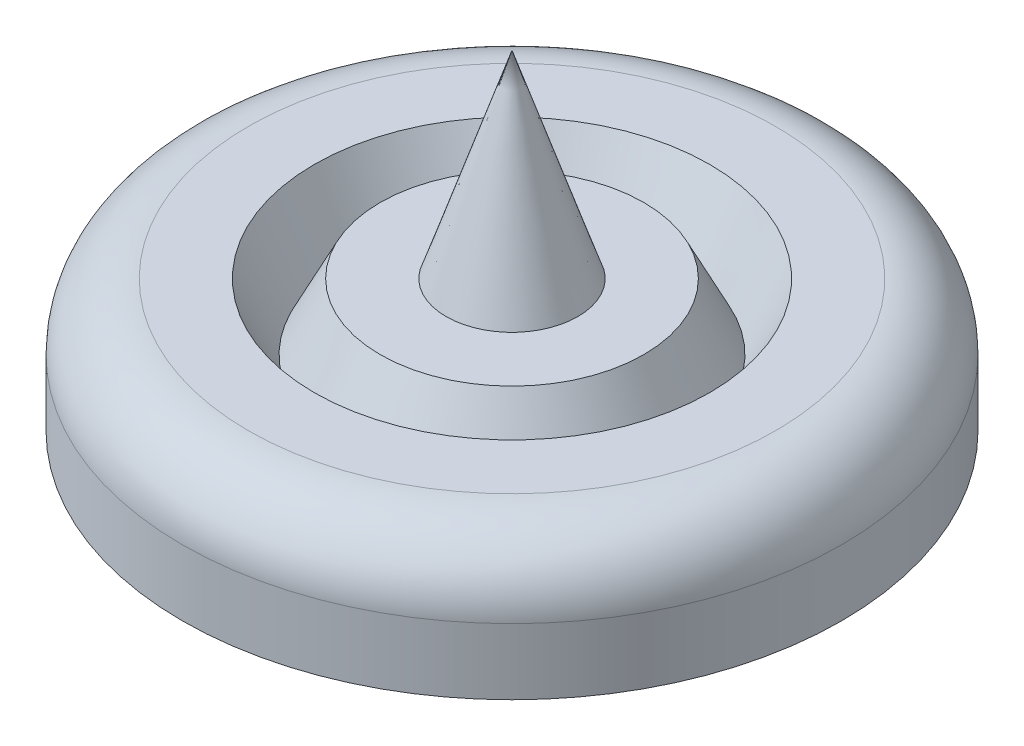
ISO-10303-21;
HEADER;
FILE_DESCRIPTION(('STEP AP214'),'2;1');
FILE_NAME('part.step','',(''),(''),'','','');
FILE_SCHEMA(('AUTOMOTIVE_DESIGN { 1 0 10303 214 1 1 1 1 }'));
ENDSEC;
DATA;
#1=APPLICATION_CONTEXT('core data for automotive mechanical design processes');
#2=APPLICATION_PROTOCOL_DEFINITION('international standard','automotive_design',2000,#1);
#3=PRODUCT_CONTEXT('',#1,'mechanical');
#4=PRODUCT('Part','Part','',(#3));
#5=PRODUCT_RELATED_PRODUCT_CATEGORY('part','',(#4));
#6=PRODUCT_DEFINITION_FORMATION('','',#4);
#7=PRODUCT_DEFINITION_CONTEXT('part definition',#1,'design');
#8=PRODUCT_DEFINITION('design','',#6,#7);
#9=PRODUCT_DEFINITION_SHAPE('','',#8);
#10=(LENGTH_UNIT() NAMED_UNIT(*) SI_UNIT(.MILLI.,.METRE.));
#11=(NAMED_UNIT(*) PLANE_ANGLE_UNIT() SI_UNIT($,.RADIAN.));
#12=(NAMED_UNIT(*) SI_UNIT($,.STERADIAN.) SOLID_ANGLE_UNIT());
#13=UNCERTAINTY_MEASURE_WITH_UNIT(LENGTH_MEASURE(1.E-05),#10,'distance_accuracy_value','');
#14=(GEOMETRIC_REPRESENTATION_CONTEXT(3) GLOBAL_UNCERTAINTY_ASSIGNED_CONTEXT((#13)) GLOBAL_UNIT_ASSIGNED_CONTEXT((#10,
#11,#12)) REPRESENTATION_CONTEXT('',''));
#15=CARTESIAN_POINT('',(0.,0.,0.));
#16=DIRECTION('',(0.,0.,1.));
#17=DIRECTION('',(1.,0.,0.));
#18=AXIS2_PLACEMENT_3D('',#15,#16,#17);
#19=CARTESIAN_POINT('',(0.,25.3999999999998,0.));
#20=DIRECTION('',(0.,1.,0.));
#21=DIRECTION('',(0.,0.,1.));
#22=AXIS2_PLACEMENT_3D('',#19,#20,#21);
#23=TOROIDAL_SURFACE('',#22,101.6,25.4);
#24=CARTESIAN_POINT('',(0.,50.7999999999998,0.));
#25=DIRECTION('',(0.,1.,0.));
#26=DIRECTION('',(0.,0.,1.));
#27=AXIS2_PLACEMENT_3D('',#24,#25,#26);
#28=CIRCLE('',#27,101.6);
#29=CARTESIAN_POINT('',(0.,50.7999999999998,101.6));
#30=VERTEX_POINT('',#29);
#31=EDGE_CURVE('E11',#30,#30,#28,.T.);
#32=ORIENTED_EDGE('',*,*,#31,.F.);
#33=EDGE_LOOP('',(#32));
#34=FACE_BOUND('',#33,.T.);
#35=CARTESIAN_POINT('',(0.,25.3999999999998,0.));
#36=DIRECTION('',(0.,1.,0.));
#37=DIRECTION('',(0.,0.,1.));
#38=AXIS2_PLACEMENT_3D('',#35,#36,#37);
#39=CIRCLE('',#38,127.);
#40=CARTESIAN_POINT('',(0.,25.3999999999998,127.));
#41=VERTEX_POINT('',#40);
#42=EDGE_CURVE('E94',#41,#41,#39,.T.);
#43=ORIENTED_EDGE('',*,*,#42,.T.);
#44=EDGE_LOOP('',(#43));
#45=FACE_BOUND('',#44,.T.);
#46=ADVANCED_FACE('F39',(#34,#45),#23,.T.);
#47=CARTESIAN_POINT('',(76.2,50.7999999999998,0.));
#48=DIRECTION('',(0.,-1.,0.));
#49=DIRECTION('',(0.,0.,-1.));
#50=AXIS2_PLACEMENT_3D('',#47,#48,#49);
#51=PLANE('',#50);
#52=CARTESIAN_POINT('',(0.,50.7999999999998,0.));
#53=DIRECTION('',(0.,1.,0.));
#54=DIRECTION('',(0.,0.,1.));
#55=AXIS2_PLACEMENT_3D('',#52,#53,#54);
#56=CIRCLE('',#55,76.2);
#57=CARTESIAN_POINT('',(0.,50.7999999999998,76.2));
#58=VERTEX_POINT('',#57);
#59=EDGE_CURVE('E47',#58,#58,#56,.T.);
#60=ORIENTED_EDGE('',*,*,#59,.F.);
#61=EDGE_LOOP('',(#60));
#62=FACE_BOUND('',#61,.T.);
#63=ORIENTED_EDGE('',*,*,#31,.T.);
#64=EDGE_LOOP('',(#63));
#65=FACE_BOUND('',#64,.T.);
#66=ADVANCED_FACE('F85',(#62,#65),#51,.F.);
#67=CARTESIAN_POINT('',(0.,50.7999999999998,0.));
#68=DIRECTION('',(0.,1.,0.));
#69=DIRECTION('',(0.,0.,1.));
#70=AXIS2_PLACEMENT_3D('',#67,#68,#69);
#71=CONICAL_SURFACE('',#70,76.2,0.463647609000806);
#72=CARTESIAN_POINT('',(0.,25.3999999999998,0.));
#73=DIRECTION('',(0.,1.,0.));
#74=DIRECTION('',(0.,0.,1.));
#75=AXIS2_PLACEMENT_3D('',#72,#73,#74);
#76=CIRCLE('',#75,63.5);
#77=CARTESIAN_POINT('',(0.,25.3999999999998,63.5));
#78=VERTEX_POINT('',#77);
#79=EDGE_CURVE('E70',#78,#78,#76,.T.);
#80=ORIENTED_EDGE('',*,*,#79,.F.);
#81=EDGE_LOOP('',(#80));
#82=FACE_BOUND('',#81,.T.);
#83=ORIENTED_EDGE('',*,*,#59,.T.);
#84=EDGE_LOOP('',(#83));
#85=FACE_BOUND('',#84,.T.);
#86=ADVANCED_FACE('F83',(#82,#85),#71,.F.);
#87=CARTESIAN_POINT('',(0.,25.3999999999998,0.));
#88=DIRECTION('',(0.,-1.,0.));
#89=DIRECTION('',(0.,0.,-1.));
#90=AXIS2_PLACEMENT_3D('',#87,#88,#89);
#91=CONICAL_SURFACE('',#90,63.5,0.463647609000806);
#92=CARTESIAN_POINT('',(0.,50.7999999999998,0.));
#93=DIRECTION('',(0.,1.,0.));
#94=DIRECTION('',(0.,0.,1.));
#95=AXIS2_PLACEMENT_3D('',#92,#93,#94);
#96=CIRCLE('',#95,50.8);
#97=CARTESIAN_POINT('',(0.,50.7999999999998,50.8));
#98=VERTEX_POINT('',#97);
#99=EDGE_CURVE('E64',#98,#98,#96,.T.);
#100=ORIENTED_EDGE('',*,*,#99,.F.);
#101=EDGE_LOOP('',(#100));
#102=FACE_BOUND('',#101,.T.);
#103=ORIENTED_EDGE('',*,*,#79,.T.);
#104=EDGE_LOOP('',(#103));
#105=FACE_BOUND('',#104,.T.);
#106=ADVANCED_FACE('F118',(#102,#105),#91,.T.);
#107=CARTESIAN_POINT('',(25.4,50.7999999999998,0.));
#108=DIRECTION('',(0.,-1.,0.));
#109=DIRECTION('',(0.,0.,-1.));
#110=AXIS2_PLACEMENT_3D('',#107,#108,#109);
#111=PLANE('',#110);
#112=CARTESIAN_POINT('',(0.,50.7999999999998,0.));
#113=DIRECTION('',(0.,1.,0.));
#114=DIRECTION('',(0.,0.,1.));
#115=AXIS2_PLACEMENT_3D('',#112,#113,#114);
#116=CIRCLE('',#115,25.4);
#117=CARTESIAN_POINT('',(0.,50.7999999999998,25.4));
#118=VERTEX_POINT('',#117);
#119=EDGE_CURVE('E61',#118,#118,#116,.T.);
#120=ORIENTED_EDGE('',*,*,#119,.F.);
#121=EDGE_LOOP('',(#120));
#122=FACE_BOUND('',#121,.T.);
#123=ORIENTED_EDGE('',*,*,#99,.T.);
#124=EDGE_LOOP('',(#123));
#125=FACE_BOUND('',#124,.T.);
#126=ADVANCED_FACE('F57',(#122,#125),#111,.F.);
#127=CARTESIAN_POINT('',(0.,50.7999999999998,0.));
#128=DIRECTION('',(0.,-1.,0.));
#129=DIRECTION('',(0.,0.,-1.));
#130=AXIS2_PLACEMENT_3D('',#127,#128,#129);
#131=CONICAL_SURFACE('',#130,25.4,0.321750554396643);
#132=CARTESIAN_POINT('',(0.,127.,0.));
#133=VERTEX_POINT('',#132);
#134=VERTEX_LOOP('',#133);
#135=FACE_BOUND('',#134,.T.);
#136=ORIENTED_EDGE('',*,*,#119,.T.);
#137=EDGE_LOOP('',(#136));
#138=FACE_BOUND('',#137,.T.);
#139=ADVANCED_FACE('F53',(#135,#138),#131,.T.);
#140=CARTESIAN_POINT('',(0.,25.3999999999998,0.));
#141=DIRECTION('',(0.,-1.,0.));
#142=DIRECTION('',(0.,0.,-1.));
#143=AXIS2_PLACEMENT_3D('',#140,#141,#142);
#144=CONICAL_SURFACE('',#143,0.,0.785398163397448);
#145=CARTESIAN_POINT('',(0.,-2.22044604925031E-13,0.));
#146=DIRECTION('',(0.,1.,0.));
#147=DIRECTION('',(0.,0.,1.));
#148=AXIS2_PLACEMENT_3D('',#145,#146,#147);
#149=CIRCLE('',#148,25.4);
#150=CARTESIAN_POINT('',(0.,-2.22044604925031E-13,25.4));
#151=VERTEX_POINT('',#150);
#152=EDGE_CURVE('E65',#151,#151,#149,.T.);
#153=ORIENTED_EDGE('',*,*,#152,.F.);
#154=EDGE_LOOP('',(#153));
#155=FACE_BOUND('',#154,.T.);
#156=CARTESIAN_POINT('',(0.,25.3999999999998,0.));
#157=VERTEX_POINT('',#156);
#158=VERTEX_LOOP('',#157);
#159=FACE_BOUND('',#158,.T.);
#160=ADVANCED_FACE('F56',(#155,#159),#144,.F.);
#161=CARTESIAN_POINT('',(25.4,-1.01961289696877E-13,0.));
#162=DIRECTION('',(0.,1.,0.));
#163=DIRECTION('',(0.,0.,1.));
#164=AXIS2_PLACEMENT_3D('',#161,#162,#163);
#165=PLANE('',#164);
#166=CARTESIAN_POINT('',(0.,0.,0.));
#167=DIRECTION('',(0.,1.,0.));
#168=DIRECTION('',(0.,0.,1.));
#169=AXIS2_PLACEMENT_3D('',#166,#167,#168);
#170=CIRCLE('',#169,127.);
#171=CARTESIAN_POINT('',(0.,0.,127.));
#172=VERTEX_POINT('',#171);
#173=EDGE_CURVE('E73',#172,#172,#170,.T.);
#174=ORIENTED_EDGE('',*,*,#173,.F.);
#175=EDGE_LOOP('',(#174));
#176=FACE_BOUND('',#175,.T.);
#177=ORIENTED_EDGE('',*,*,#152,.T.);
#178=EDGE_LOOP('',(#177));
#179=FACE_BOUND('',#178,.T.);
#180=ADVANCED_FACE('F104',(#176,#179),#165,.F.);
#181=CARTESIAN_POINT('',(0.,127.,0.));
#182=DIRECTION('',(0.,1.,0.));
#183=DIRECTION('',(0.,0.,1.));
#184=AXIS2_PLACEMENT_3D('',#181,#182,#183);
#185=CYLINDRICAL_SURFACE('',#184,127.);
#186=ORIENTED_EDGE('',*,*,#42,.F.);
#187=EDGE_LOOP('',(#186));
#188=FACE_BOUND('',#187,.T.);
#189=ORIENTED_EDGE('',*,*,#173,.T.);
#190=EDGE_LOOP('',(#189));
#191=FACE_BOUND('',#190,.T.);
#192=ADVANCED_FACE('F102',(#188,#191),#185,.T.);
#193=CLOSED_SHELL('',(#46,#66,#86,#106,#126,#139,#160,#180,#192));
#194=MANIFOLD_SOLID_BREP('B2',#193);
#195=ADVANCED_BREP_SHAPE_REPRESENTATION('',(#18,#194),#14);
#196=SHAPE_DEFINITION_REPRESENTATION(#9,#195);
ENDSEC;
END-ISO-10303-21;
